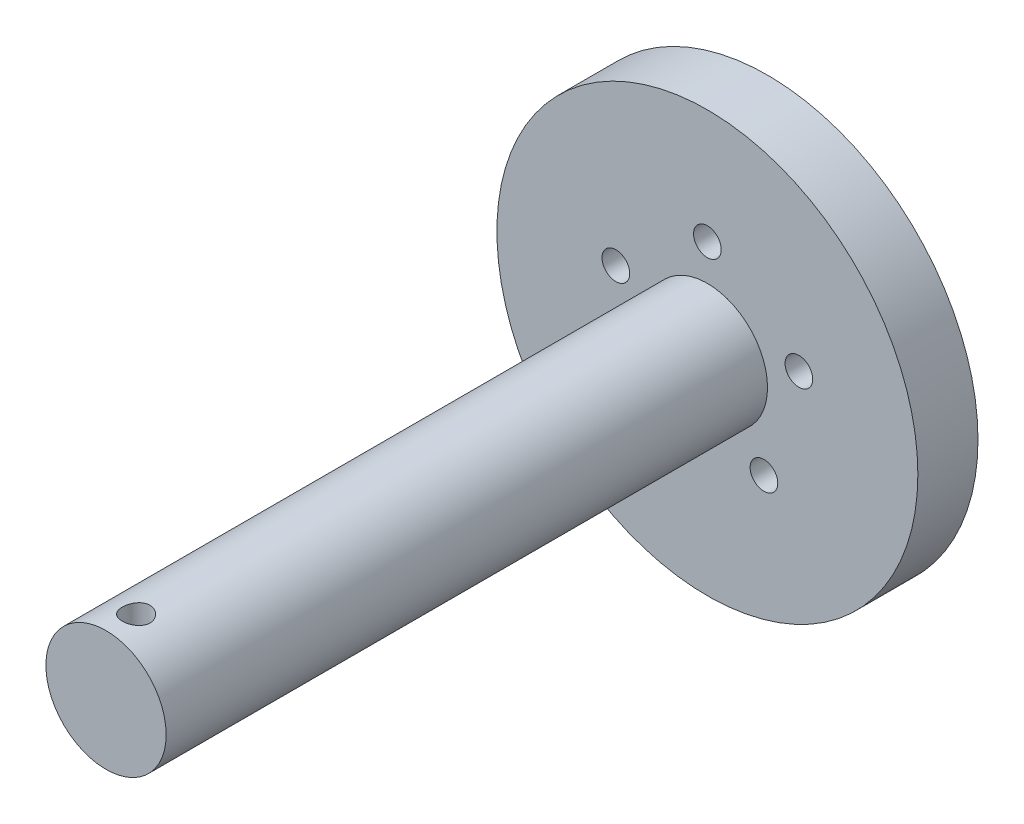
ISO-10303-21;
HEADER;
FILE_DESCRIPTION(('STEP AP214'),'2;1');
FILE_NAME('part.step','',(''),(''),'','','');
FILE_SCHEMA(('AUTOMOTIVE_DESIGN { 1 0 10303 214 1 1 1 1 }'));
ENDSEC;
DATA;
#1=APPLICATION_CONTEXT('core data for automotive mechanical design processes');
#2=APPLICATION_PROTOCOL_DEFINITION('international standard','automotive_design',2000,#1);
#3=PRODUCT_CONTEXT('',#1,'mechanical');
#4=PRODUCT('Part','Part','',(#3));
#5=PRODUCT_RELATED_PRODUCT_CATEGORY('part','',(#4));
#6=PRODUCT_DEFINITION_FORMATION('','',#4);
#7=PRODUCT_DEFINITION_CONTEXT('part definition',#1,'design');
#8=PRODUCT_DEFINITION('design','',#6,#7);
#9=PRODUCT_DEFINITION_SHAPE('','',#8);
#10=(LENGTH_UNIT() NAMED_UNIT(*) SI_UNIT(.MILLI.,.METRE.));
#11=(NAMED_UNIT(*) PLANE_ANGLE_UNIT() SI_UNIT($,.RADIAN.));
#12=(NAMED_UNIT(*) SI_UNIT($,.STERADIAN.) SOLID_ANGLE_UNIT());
#13=UNCERTAINTY_MEASURE_WITH_UNIT(LENGTH_MEASURE(1.E-05),#10,'distance_accuracy_value','');
#14=(GEOMETRIC_REPRESENTATION_CONTEXT(3) GLOBAL_UNCERTAINTY_ASSIGNED_CONTEXT((#13)) GLOBAL_UNIT_ASSIGNED_CONTEXT((#10,
#11,#12)) REPRESENTATION_CONTEXT('',''));
#15=CARTESIAN_POINT('',(0.,0.,0.));
#16=DIRECTION('',(0.,0.,1.));
#17=DIRECTION('',(1.,0.,0.));
#18=AXIS2_PLACEMENT_3D('',#15,#16,#17);
#19=CARTESIAN_POINT('',(0.,0.,12.7));
#20=DIRECTION('',(0.,0.,1.));
#21=DIRECTION('',(1.,0.,0.));
#22=AXIS2_PLACEMENT_3D('',#19,#20,#21);
#23=PLANE('',#22);
#24=CARTESIAN_POINT('',(0.,0.,12.7));
#25=DIRECTION('',(0.,0.,1.));
#26=DIRECTION('',(1.,0.,0.));
#27=AXIS2_PLACEMENT_3D('',#24,#25,#26);
#28=CIRCLE('',#27,12.7);
#29=CARTESIAN_POINT('',(12.7,0.,12.7));
#30=VERTEX_POINT('',#29);
#31=EDGE_CURVE('E91',#30,#30,#28,.T.);
#32=ORIENTED_EDGE('',*,*,#31,.F.);
#33=EDGE_LOOP('',(#32));
#34=FACE_BOUND('',#33,.T.);
#35=CARTESIAN_POINT('',(-11.9437963265832,-16.4392253256988,12.7));
#36=DIRECTION('',(0.,0.,1.));
#37=DIRECTION('',(1.,0.,0.));
#38=AXIS2_PLACEMENT_3D('',#35,#36,#37);
#39=CIRCLE('',#38,2.921);
#40=CARTESIAN_POINT('',(-9.02279632658319,-16.4392253256988,12.7));
#41=VERTEX_POINT('',#40);
#42=EDGE_CURVE('E71',#41,#41,#39,.T.);
#43=ORIENTED_EDGE('',*,*,#42,.F.);
#44=EDGE_LOOP('',(#43));
#45=FACE_BOUND('',#44,.T.);
#46=CARTESIAN_POINT('',(19.3254684111175,6.27922532569888,12.7));
#47=DIRECTION('',(0.,0.,1.));
#48=DIRECTION('',(1.,0.,0.));
#49=AXIS2_PLACEMENT_3D('',#46,#47,#48);
#50=CIRCLE('',#49,2.921);
#51=CARTESIAN_POINT('',(22.2464684111175,6.27922532569888,12.7));
#52=VERTEX_POINT('',#51);
#53=EDGE_CURVE('E55',#52,#52,#50,.T.);
#54=ORIENTED_EDGE('',*,*,#53,.F.);
#55=EDGE_LOOP('',(#54));
#56=FACE_BOUND('',#55,.T.);
#57=CARTESIAN_POINT('',(0.,0.,12.7));
#58=DIRECTION('',(0.,0.,1.));
#59=DIRECTION('',(1.,0.,0.));
#60=AXIS2_PLACEMENT_3D('',#57,#58,#59);
#61=CIRCLE('',#60,44.45);
#62=CARTESIAN_POINT('',(44.45,0.,12.7));
#63=VERTEX_POINT('',#62);
#64=EDGE_CURVE('E10',#63,#63,#61,.T.);
#65=ORIENTED_EDGE('',*,*,#64,.T.);
#66=EDGE_LOOP('',(#65));
#67=FACE_BOUND('',#66,.T.);
#68=CARTESIAN_POINT('',(0.,20.32,12.7));
#69=DIRECTION('',(0.,0.,1.));
#70=DIRECTION('',(1.,0.,0.));
#71=AXIS2_PLACEMENT_3D('',#68,#69,#70);
#72=CIRCLE('',#71,2.921);
#73=CARTESIAN_POINT('',(2.921,20.32,12.7));
#74=VERTEX_POINT('',#73);
#75=EDGE_CURVE('E49',#74,#74,#72,.T.);
#76=ORIENTED_EDGE('',*,*,#75,.F.);
#77=EDGE_LOOP('',(#76));
#78=FACE_BOUND('',#77,.T.);
#79=CARTESIAN_POINT('',(11.943796326583,-16.439225325699,12.7));
#80=DIRECTION('',(0.,0.,1.));
#81=DIRECTION('',(1.,0.,0.));
#82=AXIS2_PLACEMENT_3D('',#79,#80,#81);
#83=CIRCLE('',#82,2.921);
#84=CARTESIAN_POINT('',(14.864796326583,-16.439225325699,12.7));
#85=VERTEX_POINT('',#84);
#86=EDGE_CURVE('E63',#85,#85,#83,.T.);
#87=ORIENTED_EDGE('',*,*,#86,.F.);
#88=EDGE_LOOP('',(#87));
#89=FACE_BOUND('',#88,.T.);
#90=CARTESIAN_POINT('',(-19.3254684111175,6.27922532569915,12.7));
#91=DIRECTION('',(0.,0.,1.));
#92=DIRECTION('',(1.,0.,0.));
#93=AXIS2_PLACEMENT_3D('',#90,#91,#92);
#94=CIRCLE('',#93,2.921);
#95=CARTESIAN_POINT('',(-16.4044684111175,6.27922532569915,12.7));
#96=VERTEX_POINT('',#95);
#97=EDGE_CURVE('E79',#96,#96,#94,.T.);
#98=ORIENTED_EDGE('',*,*,#97,.F.);
#99=EDGE_LOOP('',(#98));
#100=FACE_BOUND('',#99,.T.);
#101=ADVANCED_FACE('F36',(#34,#45,#56,#67,#78,#89,#100),#23,.T.);
#102=CARTESIAN_POINT('',(0.,0.,0.));
#103=DIRECTION('',(0.,0.,1.));
#104=DIRECTION('',(1.,0.,0.));
#105=AXIS2_PLACEMENT_3D('',#102,#103,#104);
#106=PLANE('',#105);
#107=CARTESIAN_POINT('',(0.,0.,0.));
#108=DIRECTION('',(0.,0.,1.));
#109=DIRECTION('',(1.,0.,0.));
#110=AXIS2_PLACEMENT_3D('',#107,#108,#109);
#111=CIRCLE('',#110,44.45);
#112=CARTESIAN_POINT('',(44.45,0.,0.));
#113=VERTEX_POINT('',#112);
#114=EDGE_CURVE('E40',#113,#113,#111,.T.);
#115=ORIENTED_EDGE('',*,*,#114,.F.);
#116=EDGE_LOOP('',(#115));
#117=FACE_BOUND('',#116,.T.);
#118=CARTESIAN_POINT('',(0.,20.32,0.));
#119=DIRECTION('',(0.,0.,1.));
#120=DIRECTION('',(1.,0.,0.));
#121=AXIS2_PLACEMENT_3D('',#118,#119,#120);
#122=CIRCLE('',#121,2.921);
#123=CARTESIAN_POINT('',(2.921,20.32,0.));
#124=VERTEX_POINT('',#123);
#125=EDGE_CURVE('E51',#124,#124,#122,.T.);
#126=ORIENTED_EDGE('',*,*,#125,.T.);
#127=EDGE_LOOP('',(#126));
#128=FACE_BOUND('',#127,.T.);
#129=CARTESIAN_POINT('',(19.3254684111175,6.27922532569888,0.));
#130=DIRECTION('',(0.,0.,1.));
#131=DIRECTION('',(1.,0.,0.));
#132=AXIS2_PLACEMENT_3D('',#129,#130,#131);
#133=CIRCLE('',#132,2.921);
#134=CARTESIAN_POINT('',(22.2464684111175,6.27922532569888,0.));
#135=VERTEX_POINT('',#134);
#136=EDGE_CURVE('E59',#135,#135,#133,.T.);
#137=ORIENTED_EDGE('',*,*,#136,.T.);
#138=EDGE_LOOP('',(#137));
#139=FACE_BOUND('',#138,.T.);
#140=CARTESIAN_POINT('',(11.943796326583,-16.439225325699,0.));
#141=DIRECTION('',(0.,0.,1.));
#142=DIRECTION('',(1.,0.,0.));
#143=AXIS2_PLACEMENT_3D('',#140,#141,#142);
#144=CIRCLE('',#143,2.921);
#145=CARTESIAN_POINT('',(14.864796326583,-16.439225325699,0.));
#146=VERTEX_POINT('',#145);
#147=EDGE_CURVE('E67',#146,#146,#144,.T.);
#148=ORIENTED_EDGE('',*,*,#147,.T.);
#149=EDGE_LOOP('',(#148));
#150=FACE_BOUND('',#149,.T.);
#151=CARTESIAN_POINT('',(-11.9437963265832,-16.4392253256988,0.));
#152=DIRECTION('',(0.,0.,1.));
#153=DIRECTION('',(1.,0.,0.));
#154=AXIS2_PLACEMENT_3D('',#151,#152,#153);
#155=CIRCLE('',#154,2.921);
#156=CARTESIAN_POINT('',(-9.02279632658319,-16.4392253256988,0.));
#157=VERTEX_POINT('',#156);
#158=EDGE_CURVE('E75',#157,#157,#155,.T.);
#159=ORIENTED_EDGE('',*,*,#158,.T.);
#160=EDGE_LOOP('',(#159));
#161=FACE_BOUND('',#160,.T.);
#162=CARTESIAN_POINT('',(-19.3254684111175,6.27922532569915,0.));
#163=DIRECTION('',(0.,0.,1.));
#164=DIRECTION('',(1.,0.,0.));
#165=AXIS2_PLACEMENT_3D('',#162,#163,#164);
#166=CIRCLE('',#165,2.921);
#167=CARTESIAN_POINT('',(-16.4044684111175,6.27922532569915,0.));
#168=VERTEX_POINT('',#167);
#169=EDGE_CURVE('E83',#168,#168,#166,.T.);
#170=ORIENTED_EDGE('',*,*,#169,.T.);
#171=EDGE_LOOP('',(#170));
#172=FACE_BOUND('',#171,.T.);
#173=ADVANCED_FACE('F148',(#117,#128,#139,#150,#161,#172),#106,.F.);
#174=CARTESIAN_POINT('',(0.,0.,12.7));
#175=DIRECTION('',(0.,0.,-1.));
#176=DIRECTION('',(-1.,0.,0.));
#177=AXIS2_PLACEMENT_3D('',#174,#175,#176);
#178=CYLINDRICAL_SURFACE('',#177,44.45);
#179=ORIENTED_EDGE('',*,*,#64,.F.);
#180=EDGE_LOOP('',(#179));
#181=FACE_BOUND('',#180,.T.);
#182=ORIENTED_EDGE('',*,*,#114,.T.);
#183=EDGE_LOOP('',(#182));
#184=FACE_BOUND('',#183,.T.);
#185=ADVANCED_FACE('F38',(#181,#184),#178,.T.);
#186=CARTESIAN_POINT('',(0.,20.32,12.7));
#187=DIRECTION('',(0.,0.,-1.));
#188=DIRECTION('',(-1.,0.,0.));
#189=AXIS2_PLACEMENT_3D('',#186,#187,#188);
#190=CYLINDRICAL_SURFACE('',#189,2.921);
#191=ORIENTED_EDGE('',*,*,#75,.T.);
#192=EDGE_LOOP('',(#191));
#193=FACE_BOUND('',#192,.T.);
#194=ORIENTED_EDGE('',*,*,#125,.F.);
#195=EDGE_LOOP('',(#194));
#196=FACE_BOUND('',#195,.T.);
#197=ADVANCED_FACE('F142',(#193,#196),#190,.F.);
#198=CARTESIAN_POINT('',(19.3254684111175,6.27922532569888,12.7));
#199=DIRECTION('',(0.,0.,-1.));
#200=DIRECTION('',(-1.,0.,0.));
#201=AXIS2_PLACEMENT_3D('',#198,#199,#200);
#202=CYLINDRICAL_SURFACE('',#201,2.921);
#203=ORIENTED_EDGE('',*,*,#53,.T.);
#204=EDGE_LOOP('',(#203));
#205=FACE_BOUND('',#204,.T.);
#206=ORIENTED_EDGE('',*,*,#136,.F.);
#207=EDGE_LOOP('',(#206));
#208=FACE_BOUND('',#207,.T.);
#209=ADVANCED_FACE('F138',(#205,#208),#202,.F.);
#210=CARTESIAN_POINT('',(11.943796326583,-16.439225325699,12.7));
#211=DIRECTION('',(0.,0.,-1.));
#212=DIRECTION('',(-1.,0.,0.));
#213=AXIS2_PLACEMENT_3D('',#210,#211,#212);
#214=CYLINDRICAL_SURFACE('',#213,2.921);
#215=ORIENTED_EDGE('',*,*,#86,.T.);
#216=EDGE_LOOP('',(#215));
#217=FACE_BOUND('',#216,.T.);
#218=ORIENTED_EDGE('',*,*,#147,.F.);
#219=EDGE_LOOP('',(#218));
#220=FACE_BOUND('',#219,.T.);
#221=ADVANCED_FACE('F134',(#217,#220),#214,.F.);
#222=CARTESIAN_POINT('',(-11.9437963265832,-16.4392253256988,12.7));
#223=DIRECTION('',(0.,0.,-1.));
#224=DIRECTION('',(-1.,0.,0.));
#225=AXIS2_PLACEMENT_3D('',#222,#223,#224);
#226=CYLINDRICAL_SURFACE('',#225,2.921);
#227=ORIENTED_EDGE('',*,*,#42,.T.);
#228=EDGE_LOOP('',(#227));
#229=FACE_BOUND('',#228,.T.);
#230=ORIENTED_EDGE('',*,*,#158,.F.);
#231=EDGE_LOOP('',(#230));
#232=FACE_BOUND('',#231,.T.);
#233=ADVANCED_FACE('F130',(#229,#232),#226,.F.);
#234=CARTESIAN_POINT('',(-19.3254684111175,6.27922532569915,12.7));
#235=DIRECTION('',(0.,0.,-1.));
#236=DIRECTION('',(-1.,0.,0.));
#237=AXIS2_PLACEMENT_3D('',#234,#235,#236);
#238=CYLINDRICAL_SURFACE('',#237,2.921);
#239=ORIENTED_EDGE('',*,*,#97,.T.);
#240=EDGE_LOOP('',(#239));
#241=FACE_BOUND('',#240,.T.);
#242=ORIENTED_EDGE('',*,*,#169,.F.);
#243=EDGE_LOOP('',(#242));
#244=FACE_BOUND('',#243,.T.);
#245=ADVANCED_FACE('F126',(#241,#244),#238,.F.);
#246=CARTESIAN_POINT('',(0.,0.,139.7));
#247=DIRECTION('',(0.,0.,-1.));
#248=DIRECTION('',(-1.,0.,0.));
#249=AXIS2_PLACEMENT_3D('',#246,#247,#248);
#250=CYLINDRICAL_SURFACE('',#249,12.7);
#251=CARTESIAN_POINT('',(0.,12.7,130.429));
#252=CARTESIAN_POINT('',(-0.161791988365735,12.6999970647349,130.429005213744));
#253=CARTESIAN_POINT('',(-0.323645239309981,12.6968770614982,130.442487643187));
#254=CARTESIAN_POINT('',(-0.642739986536925,12.6847324159928,130.495996615792));
#255=CARTESIAN_POINT('',(-0.79997835148879,12.6757038571514,130.536040766019));
#256=CARTESIAN_POINT('',(-1.10518689570164,12.652745471281,130.641341248176));
#257=CARTESIAN_POINT('',(-1.25316705672757,12.6388210338969,130.706569863414));
#258=CARTESIAN_POINT('',(-1.5360803658525,12.6075668031072,130.860296316434));
#259=CARTESIAN_POINT('',(-1.67101357676364,12.5902370260972,130.948794042183));
#260=CARTESIAN_POINT('',(-1.92638521991923,12.5537230179431,131.14819690832));
#261=CARTESIAN_POINT('',(-2.0465607059451,12.5345137956361,131.259434248321));
#262=CARTESIAN_POINT('',(-2.26672366205061,12.4965784293557,131.500446215234));
#263=CARTESIAN_POINT('',(-2.36670917577203,12.4778523323493,131.630222636458));
#264=CARTESIAN_POINT('',(-2.54484046143641,12.4427552467236,131.906606790747));
#265=CARTESIAN_POINT('',(-2.62270139498788,12.4264161844912,132.053402522439));
#266=CARTESIAN_POINT('',(-2.75254466561769,12.3983039513594,132.358433630615));
#267=CARTESIAN_POINT('',(-2.8045304514541,12.3865301720245,132.516667479354));
#268=CARTESIAN_POINT('',(-2.88026898262258,12.3691369635251,132.83721680994));
#269=CARTESIAN_POINT('',(-2.90448985025934,12.3634156206721,132.9994160334));
#270=CARTESIAN_POINT('',(-2.92546749520376,12.3584693670794,133.32566884009));
#271=CARTESIAN_POINT('',(-2.92222802034675,12.3592435698163,133.489722167217));
#272=CARTESIAN_POINT('',(-2.88875253307512,12.3671088866499,133.811509627339));
#273=CARTESIAN_POINT('',(-2.85906508317054,12.3740716361207,133.969304445191));
#274=CARTESIAN_POINT('',(-2.77440752094658,12.3933260161791,134.277611977654));
#275=CARTESIAN_POINT('',(-2.71943585654971,12.4056179738986,134.428124244597));
#276=CARTESIAN_POINT('',(-2.58527929519974,12.4342692457019,134.719111573749));
#277=CARTESIAN_POINT('',(-2.50588759799799,12.4506630660977,134.859487753486));
#278=CARTESIAN_POINT('',(-2.32528973017408,12.4856503267689,135.125126322198));
#279=CARTESIAN_POINT('',(-2.22408029046686,12.5042440964873,135.25038644185));
#280=CARTESIAN_POINT('',(-1.99983760019351,12.5420834491417,135.485390591578));
#281=CARTESIAN_POINT('',(-1.87633907073827,12.5613339683604,135.59469033427));
#282=CARTESIAN_POINT('',(-1.61254226059999,12.5979129810336,135.791104268127));
#283=CARTESIAN_POINT('',(-1.47224360995676,12.6152414321455,135.878217970594));
#284=CARTESIAN_POINT('',(-1.17825525523572,12.6460898028565,136.027914942753));
#285=CARTESIAN_POINT('',(-1.02453236430193,12.6595999127898,136.09043518803));
#286=CARTESIAN_POINT('',(-0.708381581725827,12.6812171472574,136.188630437952));
#287=CARTESIAN_POINT('',(-0.545955097640874,12.6893251425971,136.224309769396));
#288=CARTESIAN_POINT('',(-0.220814435132272,12.6990989390001,136.267153041478));
#289=CARTESIAN_POINT('',(-0.058184144040457,12.7009016765217,136.274923210548));
#290=CARTESIAN_POINT('',(0.266051162109866,12.6982477443443,136.263377509984));
#291=CARTESIAN_POINT('',(0.42765625356299,12.693791546678,136.244063682957));
#292=CARTESIAN_POINT('',(0.743211224842895,12.679207342039,136.17940005274));
#293=CARTESIAN_POINT('',(0.89723070733154,12.6691496042788,136.134372642662));
#294=CARTESIAN_POINT('',(1.19552825469157,12.644490195932,136.01992143889));
#295=CARTESIAN_POINT('',(1.33980543038585,12.6298881112647,135.950495421921));
#296=CARTESIAN_POINT('',(1.61699707115781,12.5974249490779,135.787985413114));
#297=CARTESIAN_POINT('',(1.74970046025282,12.5795168136959,135.694551006639));
#298=CARTESIAN_POINT('',(1.99776154113809,12.5425159177875,135.487133113221));
#299=CARTESIAN_POINT('',(2.11311672034808,12.5234229862289,135.373146654925));
#300=CARTESIAN_POINT('',(2.32563938819833,12.4857243417873,135.125065950726));
#301=CARTESIAN_POINT('',(2.4223850279899,12.4671366696917,134.990607045736));
#302=CARTESIAN_POINT('',(2.59192805334683,12.4329971520183,134.706996717731));
#303=CARTESIAN_POINT('',(2.66472650260241,12.4174451716131,134.557845947683));
#304=CARTESIAN_POINT('',(2.78379411562038,12.3912956852758,134.249898837761));
#305=CARTESIAN_POINT('',(2.83021721439997,12.3806694992805,134.091164574849));
#306=CARTESIAN_POINT('',(2.89565432154699,12.3655301108863,133.767869142347));
#307=CARTESIAN_POINT('',(2.91467325391904,12.3610158103073,133.603309024998));
#308=CARTESIAN_POINT('',(2.92453562219783,12.3586856440773,133.277299344076));
#309=CARTESIAN_POINT('',(2.91604962163951,12.3607103545853,133.115870852228));
#310=CARTESIAN_POINT('',(2.87265442488283,12.3708667391052,132.79681125656));
#311=CARTESIAN_POINT('',(2.83774561091784,12.3789983247748,132.639180097843));
#312=CARTESIAN_POINT('',(2.7428348616303,12.4003705499824,132.332790387718));
#313=CARTESIAN_POINT('',(2.68294030914389,12.4135893074383,132.18399694334));
#314=CARTESIAN_POINT('',(2.53984711468252,12.4436529279168,131.898474541572));
#315=CARTESIAN_POINT('',(2.45664575526635,12.4604982137189,131.761746993443));
#316=CARTESIAN_POINT('',(2.26711897554109,12.4963856088391,131.500954163352));
#317=CARTESIAN_POINT('',(2.16031993796052,12.5154682801239,131.377238592019));
#318=CARTESIAN_POINT('',(1.92757677814579,12.553418819743,131.149265937754));
#319=CARTESIAN_POINT('',(1.80162820464565,12.572286637036,131.045013391542));
#320=CARTESIAN_POINT('',(1.53193099702332,12.6080109458739,130.857450490243));
#321=CARTESIAN_POINT('',(1.38794819360233,12.624833843891,130.774470044477));
#322=CARTESIAN_POINT('',(1.0877145565923,12.6542304997702,130.634021852378));
#323=CARTESIAN_POINT('',(0.931473620756514,12.666807643198,130.576533766904));
#324=CARTESIAN_POINT('',(0.64601387556082,12.6841827727736,130.498363698891));
#325=CARTESIAN_POINT('',(0.518280603611836,12.69007614118,130.472404146052));
#326=CARTESIAN_POINT('',(0.260378026570588,12.6979858316875,130.437720662041));
#327=CARTESIAN_POINT('',(0.130208852856307,12.700002362277,130.428995804022));
#328=CARTESIAN_POINT('',(0.,12.7,130.429));
#329=B_SPLINE_CURVE_WITH_KNOTS('',3,(#251,#252,#253,#254,#255,#256,#257,#258,#259,#260,#261,
#262,#263,#264,#265,#266,#267,#268,#269,#270,#271,#272,#273,#274,#275,#276,#277,#278,#279,#280,
#281,#282,#283,#284,#285,#286,#287,#288,#289,#290,#291,#292,#293,#294,#295,#296,#297,#298,#299,
#300,#301,#302,#303,#304,#305,#306,#307,#308,#309,#310,#311,#312,#313,#314,#315,#316,#317,#318,
#319,#320,#321,#322,#323,#324,#325,#326,#327,#328),.UNSPECIFIED.,.T.,.F.,(4,2,2,2,2,2,2,2,2,2,2,
2,2,2,2,2,2,2,2,2,2,2,2,2,2,2,2,2,2,2,2,2,2,2,2,2,2,2,4),(0.,0.484899162894528,
0.970120074326082,1.4548084924728,1.93949457705973,2.43184500537261,2.92424311835149,
3.42271966492523,3.92112975446096,4.41100688626892,4.90081715987016,5.38069876831246,
5.86060983833309,6.3447024478514,6.82886764238891,7.32464721045126,7.82043769822319,
8.31749057284788,8.81446330456853,9.30057347160131,9.78664697942678,10.2667559265233,
10.7469086339406,11.2345125418666,11.7221870026933,12.2198699218079,12.7175307317752,
13.2122563831141,13.706893130625,14.1895623045773,14.6722244963531,15.1528333486867,
15.6334982606208,16.1248653125685,16.6163467567817,17.1150433796172,17.6133413970775,
18.0036052173584,18.3938480494617),.UNSPECIFIED.);
#330=CARTESIAN_POINT('',(0.,12.7,130.429));
#331=VERTEX_POINT('',#330);
#332=EDGE_CURVE('E95',#331,#331,#329,.T.);
#333=ORIENTED_EDGE('',*,*,#332,.F.);
#334=EDGE_LOOP('',(#333));
#335=FACE_BOUND('',#334,.T.);
#336=CARTESIAN_POINT('',(0.,-12.7,130.429));
#337=CARTESIAN_POINT('',(0.161791988365735,-12.6999970647349,130.429005213744));
#338=CARTESIAN_POINT('',(0.323645239309981,-12.6968770614982,130.442487643187));
#339=CARTESIAN_POINT('',(0.642739986536925,-12.6847324159928,130.495996615792));
#340=CARTESIAN_POINT('',(0.799978351488791,-12.6757038571514,130.536040766019));
#341=CARTESIAN_POINT('',(1.10518689570165,-12.652745471281,130.641341248176));
#342=CARTESIAN_POINT('',(1.25316705672759,-12.6388210338969,130.706569863414));
#343=CARTESIAN_POINT('',(1.53608036585251,-12.6075668031072,130.860296316434));
#344=CARTESIAN_POINT('',(1.67101357676365,-12.5902370260972,130.948794042183));
#345=CARTESIAN_POINT('',(1.92638521991924,-12.5537230179431,131.14819690832));
#346=CARTESIAN_POINT('',(2.04656070594511,-12.5345137956361,131.259434248321));
#347=CARTESIAN_POINT('',(2.26672366205062,-12.4965784293557,131.500446215234));
#348=CARTESIAN_POINT('',(2.36670917577204,-12.4778523323493,131.630222636458));
#349=CARTESIAN_POINT('',(2.5448404614364,-12.4427552467236,131.906606790747));
#350=CARTESIAN_POINT('',(2.62270139498788,-12.4264161844912,132.053402522439));
#351=CARTESIAN_POINT('',(2.75254466561769,-12.3983039513594,132.358433630615));
#352=CARTESIAN_POINT('',(2.8045304514541,-12.3865301720245,132.516667479354));
#353=CARTESIAN_POINT('',(2.88026898262258,-12.3691369635251,132.83721680994));
#354=CARTESIAN_POINT('',(2.90448985025934,-12.3634156206721,132.9994160334));
#355=CARTESIAN_POINT('',(2.92546749520376,-12.3584693670794,133.32566884009));
#356=CARTESIAN_POINT('',(2.92222802034675,-12.3592435698163,133.489722167217));
#357=CARTESIAN_POINT('',(2.88875253307512,-12.3671088866499,133.811509627339));
#358=CARTESIAN_POINT('',(2.85906508317054,-12.3740716361207,133.969304445191));
#359=CARTESIAN_POINT('',(2.77440752094658,-12.3933260161791,134.277611977654));
#360=CARTESIAN_POINT('',(2.71943585654971,-12.4056179738986,134.428124244597));
#361=CARTESIAN_POINT('',(2.58527929519974,-12.4342692457019,134.719111573749));
#362=CARTESIAN_POINT('',(2.50588759799799,-12.4506630660977,134.859487753486));
#363=CARTESIAN_POINT('',(2.32528973017408,-12.4856503267689,135.125126322198));
#364=CARTESIAN_POINT('',(2.22408029046686,-12.5042440964873,135.25038644185));
#365=CARTESIAN_POINT('',(1.99983760019351,-12.5420834491417,135.485390591578));
#366=CARTESIAN_POINT('',(1.87633907073827,-12.5613339683604,135.59469033427));
#367=CARTESIAN_POINT('',(1.61254226059999,-12.5979129810336,135.791104268127));
#368=CARTESIAN_POINT('',(1.47224360995676,-12.6152414321455,135.878217970594));
#369=CARTESIAN_POINT('',(1.17825525523572,-12.6460898028565,136.027914942753));
#370=CARTESIAN_POINT('',(1.02453236430193,-12.6595999127898,136.09043518803));
#371=CARTESIAN_POINT('',(0.708381581725828,-12.6812171472574,136.188630437952));
#372=CARTESIAN_POINT('',(0.545955097640874,-12.6893251425971,136.224309769396));
#373=CARTESIAN_POINT('',(0.220814435132273,-12.6990989390001,136.267153041478));
#374=CARTESIAN_POINT('',(0.0581841440404571,-12.7009016765217,136.274923210548));
#375=CARTESIAN_POINT('',(-0.266051162109866,-12.6982477443443,136.263377509984));
#376=CARTESIAN_POINT('',(-0.42765625356299,-12.693791546678,136.244063682957));
#377=CARTESIAN_POINT('',(-0.743211224842895,-12.679207342039,136.17940005274));
#378=CARTESIAN_POINT('',(-0.89723070733154,-12.6691496042788,136.134372642662));
#379=CARTESIAN_POINT('',(-1.19552825469157,-12.644490195932,136.01992143889));
#380=CARTESIAN_POINT('',(-1.33980543038585,-12.6298881112647,135.950495421921));
#381=CARTESIAN_POINT('',(-1.61699707115781,-12.5974249490779,135.787985413114));
#382=CARTESIAN_POINT('',(-1.74970046025282,-12.5795168136959,135.694551006639));
#383=CARTESIAN_POINT('',(-1.99776154113809,-12.5425159177875,135.487133113221));
#384=CARTESIAN_POINT('',(-2.11311672034808,-12.5234229862289,135.373146654925));
#385=CARTESIAN_POINT('',(-2.32563938819833,-12.4857243417873,135.125065950726));
#386=CARTESIAN_POINT('',(-2.4223850279899,-12.4671366696917,134.990607045736));
#387=CARTESIAN_POINT('',(-2.59192805334683,-12.4329971520183,134.706996717731));
#388=CARTESIAN_POINT('',(-2.66472650260241,-12.4174451716131,134.557845947683));
#389=CARTESIAN_POINT('',(-2.78379411562038,-12.3912956852758,134.249898837761));
#390=CARTESIAN_POINT('',(-2.83021721439997,-12.3806694992805,134.091164574849));
#391=CARTESIAN_POINT('',(-2.89565432154699,-12.3655301108863,133.767869142347));
#392=CARTESIAN_POINT('',(-2.91467325391904,-12.3610158103073,133.603309024998));
#393=CARTESIAN_POINT('',(-2.92453562219783,-12.3586856440773,133.277299344076));
#394=CARTESIAN_POINT('',(-2.91604962163951,-12.3607103545853,133.115870852228));
#395=CARTESIAN_POINT('',(-2.87265442488283,-12.3708667391052,132.79681125656));
#396=CARTESIAN_POINT('',(-2.83774561091784,-12.3789983247748,132.639180097843));
#397=CARTESIAN_POINT('',(-2.7428348616303,-12.4003705499824,132.332790387718));
#398=CARTESIAN_POINT('',(-2.68294030914389,-12.4135893074383,132.18399694334));
#399=CARTESIAN_POINT('',(-2.53984711468252,-12.4436529279168,131.898474541572));
#400=CARTESIAN_POINT('',(-2.45664575526635,-12.4604982137189,131.761746993443));
#401=CARTESIAN_POINT('',(-2.26711897554109,-12.4963856088391,131.500954163352));
#402=CARTESIAN_POINT('',(-2.16031993796052,-12.5154682801239,131.377238592019));
#403=CARTESIAN_POINT('',(-1.92757677814579,-12.553418819743,131.149265937754));
#404=CARTESIAN_POINT('',(-1.80162820464565,-12.572286637036,131.045013391542));
#405=CARTESIAN_POINT('',(-1.53193099702332,-12.6080109458739,130.857450490243));
#406=CARTESIAN_POINT('',(-1.38794819360233,-12.624833843891,130.774470044477));
#407=CARTESIAN_POINT('',(-1.0877145565923,-12.6542304997702,130.634021852378));
#408=CARTESIAN_POINT('',(-0.931473620756514,-12.666807643198,130.576533766904));
#409=CARTESIAN_POINT('',(-0.64601387556082,-12.6841827727736,130.498363698891));
#410=CARTESIAN_POINT('',(-0.518280603611836,-12.69007614118,130.472404146052));
#411=CARTESIAN_POINT('',(-0.260378026570588,-12.6979858316875,130.437720662041));
#412=CARTESIAN_POINT('',(-0.130208852856306,-12.700002362277,130.428995804022));
#413=CARTESIAN_POINT('',(0.,-12.7,130.429));
#414=B_SPLINE_CURVE_WITH_KNOTS('',3,(#336,#337,#338,#339,#340,#341,#342,#343,#344,#345,#346,
#347,#348,#349,#350,#351,#352,#353,#354,#355,#356,#357,#358,#359,#360,#361,#362,#363,#364,#365,
#366,#367,#368,#369,#370,#371,#372,#373,#374,#375,#376,#377,#378,#379,#380,#381,#382,#383,#384,
#385,#386,#387,#388,#389,#390,#391,#392,#393,#394,#395,#396,#397,#398,#399,#400,#401,#402,#403,
#404,#405,#406,#407,#408,#409,#410,#411,#412,#413),.UNSPECIFIED.,.T.,.F.,(4,2,2,2,2,2,2,2,2,2,2,
2,2,2,2,2,2,2,2,2,2,2,2,2,2,2,2,2,2,2,2,2,2,2,2,2,2,2,4),(0.,0.484899162894528,
0.970120074326082,1.45480849247284,1.93949457705973,2.43184500537262,2.92424311835149,
3.42271966492523,3.92112975446096,4.41100688626892,4.90081715987016,5.38069876831246,
5.86060983833309,6.3447024478514,6.82886764238891,7.32464721045126,7.82043769822319,
8.31749057284788,8.81446330456853,9.30057347160131,9.78664697942678,10.2667559265233,
10.7469086339406,11.2345125418666,11.7221870026933,12.2198699218079,12.7175307317752,
13.2122563831141,13.706893130625,14.1895623045773,14.6722244963531,15.1528333486867,
15.6334982606208,16.1248653125685,16.6163467567817,17.1150433796172,17.6133413970775,
18.0036052173584,18.3938480494617),.UNSPECIFIED.);
#415=CARTESIAN_POINT('',(0.,-12.7,130.429));
#416=VERTEX_POINT('',#415);
#417=EDGE_CURVE('E107',#416,#416,#414,.T.);
#418=ORIENTED_EDGE('',*,*,#417,.F.);
#419=EDGE_LOOP('',(#418));
#420=FACE_BOUND('',#419,.T.);
#421=CARTESIAN_POINT('',(0.,0.,139.7));
#422=DIRECTION('',(0.,0.,1.));
#423=DIRECTION('',(1.,0.,0.));
#424=AXIS2_PLACEMENT_3D('',#421,#422,#423);
#425=CIRCLE('',#424,12.7);
#426=CARTESIAN_POINT('',(12.7,0.,139.7));
#427=VERTEX_POINT('',#426);
#428=EDGE_CURVE('E87',#427,#427,#425,.T.);
#429=ORIENTED_EDGE('',*,*,#428,.F.);
#430=EDGE_LOOP('',(#429));
#431=FACE_BOUND('',#430,.T.);
#432=ORIENTED_EDGE('',*,*,#31,.T.);
#433=EDGE_LOOP('',(#432));
#434=FACE_BOUND('',#433,.T.);
#435=ADVANCED_FACE('F122',(#335,#420,#431,#434),#250,.T.);
#436=CARTESIAN_POINT('',(0.,0.,139.7));
#437=DIRECTION('',(0.,0.,1.));
#438=DIRECTION('',(1.,0.,0.));
#439=AXIS2_PLACEMENT_3D('',#436,#437,#438);
#440=PLANE('',#439);
#441=ORIENTED_EDGE('',*,*,#428,.T.);
#442=EDGE_LOOP('',(#441));
#443=FACE_BOUND('',#442,.T.);
#444=ADVANCED_FACE('F117',(#443),#440,.T.);
#445=CARTESIAN_POINT('',(0.,44.451,133.35));
#446=DIRECTION('',(0.,-1.,0.));
#447=DIRECTION('',(0.,0.,-1.));
#448=AXIS2_PLACEMENT_3D('',#445,#446,#447);
#449=CYLINDRICAL_SURFACE('',#448,2.921);
#450=ORIENTED_EDGE('',*,*,#332,.T.);
#451=EDGE_LOOP('',(#450));
#452=FACE_BOUND('',#451,.T.);
#453=ORIENTED_EDGE('',*,*,#417,.T.);
#454=EDGE_LOOP('',(#453));
#455=FACE_BOUND('',#454,.T.);
#456=ADVANCED_FACE('F111',(#452,#455),#449,.F.);
#457=CLOSED_SHELL('',(#101,#173,#185,#197,#209,#221,#233,#245,#435,#444,#456));
#458=MANIFOLD_SOLID_BREP('B2',#457);
#459=ADVANCED_BREP_SHAPE_REPRESENTATION('',(#18,#458),#14);
#460=SHAPE_DEFINITION_REPRESENTATION(#9,#459);
ENDSEC;
END-ISO-10303-21;
